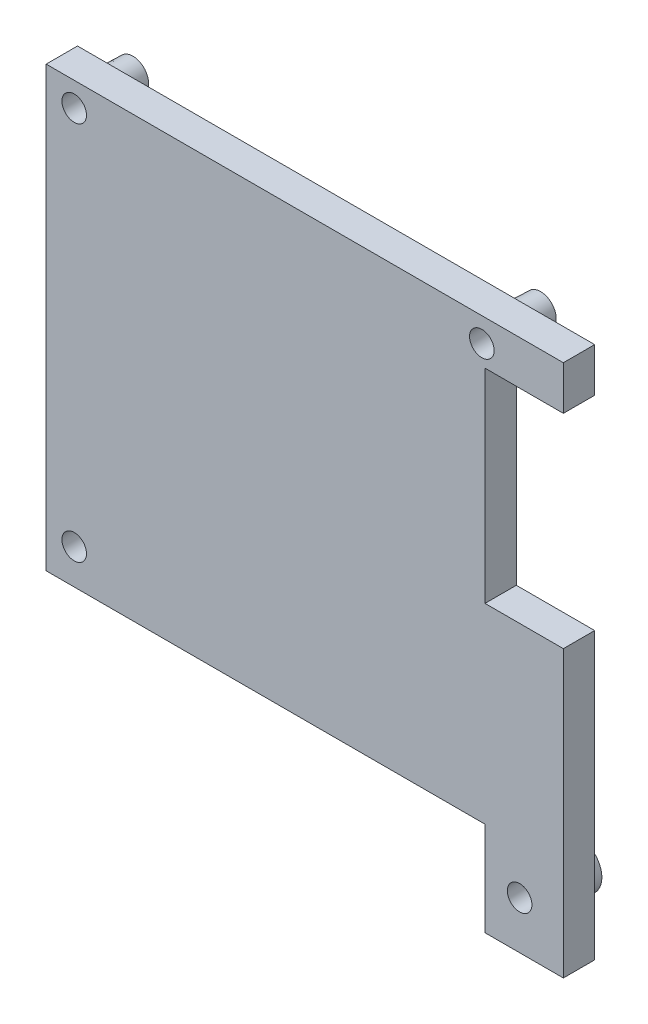
ISO-10303-21;
HEADER;
FILE_DESCRIPTION(('STEP AP214'),'2;1');
FILE_NAME('part.step','',(''),(''),'','','');
FILE_SCHEMA(('AUTOMOTIVE_DESIGN { 1 0 10303 214 1 1 1 1 }'));
ENDSEC;
DATA;
#1=APPLICATION_CONTEXT('core data for automotive mechanical design processes');
#2=APPLICATION_PROTOCOL_DEFINITION('international standard','automotive_design',2000,#1);
#3=PRODUCT_CONTEXT('',#1,'mechanical');
#4=PRODUCT('Part','Part','',(#3));
#5=PRODUCT_RELATED_PRODUCT_CATEGORY('part','',(#4));
#6=PRODUCT_DEFINITION_FORMATION('','',#4);
#7=PRODUCT_DEFINITION_CONTEXT('part definition',#1,'design');
#8=PRODUCT_DEFINITION('design','',#6,#7);
#9=PRODUCT_DEFINITION_SHAPE('','',#8);
#10=(LENGTH_UNIT() NAMED_UNIT(*) SI_UNIT(.MILLI.,.METRE.));
#11=(NAMED_UNIT(*) PLANE_ANGLE_UNIT() SI_UNIT($,.RADIAN.));
#12=(NAMED_UNIT(*) SI_UNIT($,.STERADIAN.) SOLID_ANGLE_UNIT());
#13=UNCERTAINTY_MEASURE_WITH_UNIT(LENGTH_MEASURE(1.E-05),#10,'distance_accuracy_value','');
#14=(GEOMETRIC_REPRESENTATION_CONTEXT(3) GLOBAL_UNCERTAINTY_ASSIGNED_CONTEXT((#13)) GLOBAL_UNIT_ASSIGNED_CONTEXT((#10,
#11,#12)) REPRESENTATION_CONTEXT('',''));
#15=CARTESIAN_POINT('',(0.,0.,0.));
#16=DIRECTION('',(0.,0.,1.));
#17=DIRECTION('',(1.,0.,0.));
#18=AXIS2_PLACEMENT_3D('',#15,#16,#17);
#19=CARTESIAN_POINT('',(-22.9481991421476,23.8341896442126,2.));
#20=DIRECTION('',(1.,0.,0.));
#21=DIRECTION('',(0.,1.,0.));
#22=AXIS2_PLACEMENT_3D('',#19,#20,#21);
#23=PLANE('',#22);
#24=DIRECTION('',(0.,-1.,0.));
#25=VECTOR('',#24,1.);
#26=CARTESIAN_POINT('',(-22.9481991421476,23.8341896442126,0.));
#27=LINE('',#26,#25);
#28=CARTESIAN_POINT('',(-22.9481991421476,23.8341896442126,0.));
#29=VERTEX_POINT('',#28);
#30=CARTESIAN_POINT('',(-22.9481991421476,-4.16581035578736,0.));
#31=VERTEX_POINT('',#30);
#32=EDGE_CURVE('E146',#29,#31,#27,.T.);
#33=ORIENTED_EDGE('',*,*,#32,.T.);
#34=DIRECTION('',(0.,0.,-1.));
#35=VECTOR('',#34,1.);
#36=CARTESIAN_POINT('',(-22.9481991421476,-4.16581035578736,2.));
#37=LINE('',#36,#35);
#38=CARTESIAN_POINT('',(-22.9481991421476,-4.16581035578736,2.));
#39=VERTEX_POINT('',#38);
#40=EDGE_CURVE('E11',#39,#31,#37,.T.);
#41=ORIENTED_EDGE('',*,*,#40,.F.);
#42=DIRECTION('',(0.,-1.,0.));
#43=VECTOR('',#42,1.);
#44=CARTESIAN_POINT('',(-22.9481991421476,23.8341896442126,2.));
#45=LINE('',#44,#43);
#46=CARTESIAN_POINT('',(-22.9481991421476,23.8341896442126,2.));
#47=VERTEX_POINT('',#46);
#48=EDGE_CURVE('E171',#47,#39,#45,.T.);
#49=ORIENTED_EDGE('',*,*,#48,.F.);
#50=DIRECTION('',(0.,0.,-1.));
#51=VECTOR('',#50,1.);
#52=CARTESIAN_POINT('',(-22.9481991421476,23.8341896442126,2.));
#53=LINE('',#52,#51);
#54=EDGE_CURVE('E53',#47,#29,#53,.T.);
#55=ORIENTED_EDGE('',*,*,#54,.T.);
#56=EDGE_LOOP('',(#33,#41,#49,#55));
#57=FACE_BOUND('',#56,.T.);
#58=ADVANCED_FACE('F37',(#57),#23,.F.);
#59=CARTESIAN_POINT('',(-22.9481991421476,-4.16581035578736,2.));
#60=DIRECTION('',(0.,1.,0.));
#61=DIRECTION('',(0.,0.,1.));
#62=AXIS2_PLACEMENT_3D('',#59,#60,#61);
#63=PLANE('',#62);
#64=DIRECTION('',(1.,0.,0.));
#65=VECTOR('',#64,1.);
#66=CARTESIAN_POINT('',(-22.9481991421476,-4.16581035578736,0.));
#67=LINE('',#66,#65);
#68=CARTESIAN_POINT('',(5.0518008578524,-4.16581035578736,0.));
#69=VERTEX_POINT('',#68);
#70=EDGE_CURVE('E148',#31,#69,#67,.T.);
#71=ORIENTED_EDGE('',*,*,#70,.T.);
#72=DIRECTION('',(0.,0.,-1.));
#73=VECTOR('',#72,1.);
#74=CARTESIAN_POINT('',(5.0518008578524,-4.16581035578736,2.));
#75=LINE('',#74,#73);
#76=CARTESIAN_POINT('',(5.0518008578524,-4.16581035578736,2.));
#77=VERTEX_POINT('',#76);
#78=EDGE_CURVE('E45',#77,#69,#75,.T.);
#79=ORIENTED_EDGE('',*,*,#78,.F.);
#80=DIRECTION('',(1.,0.,0.));
#81=VECTOR('',#80,1.);
#82=CARTESIAN_POINT('',(-22.9481991421476,-4.16581035578736,2.));
#83=LINE('',#82,#81);
#84=EDGE_CURVE('E97',#39,#77,#83,.T.);
#85=ORIENTED_EDGE('',*,*,#84,.F.);
#86=ORIENTED_EDGE('',*,*,#40,.T.);
#87=EDGE_LOOP('',(#71,#79,#85,#86));
#88=FACE_BOUND('',#87,.T.);
#89=ADVANCED_FACE('F226',(#88),#63,.F.);
#90=CARTESIAN_POINT('',(5.0518008578524,-4.16581035578736,2.));
#91=DIRECTION('',(1.,0.,0.));
#92=DIRECTION('',(0.,1.,0.));
#93=AXIS2_PLACEMENT_3D('',#90,#91,#92);
#94=PLANE('',#93);
#95=DIRECTION('',(0.,-1.,0.));
#96=VECTOR('',#95,1.);
#97=CARTESIAN_POINT('',(5.0518008578524,-4.16581035578736,0.));
#98=LINE('',#97,#96);
#99=CARTESIAN_POINT('',(5.0518008578524,-10.1658103557874,0.));
#100=VERTEX_POINT('',#99);
#101=EDGE_CURVE('E151',#69,#100,#98,.T.);
#102=ORIENTED_EDGE('',*,*,#101,.T.);
#103=DIRECTION('',(0.,0.,-1.));
#104=VECTOR('',#103,1.);
#105=CARTESIAN_POINT('',(5.0518008578524,-10.1658103557874,2.));
#106=LINE('',#105,#104);
#107=CARTESIAN_POINT('',(5.0518008578524,-10.1658103557874,2.));
#108=VERTEX_POINT('',#107);
#109=EDGE_CURVE('E181',#108,#100,#106,.T.);
#110=ORIENTED_EDGE('',*,*,#109,.F.);
#111=DIRECTION('',(0.,-1.,0.));
#112=VECTOR('',#111,1.);
#113=CARTESIAN_POINT('',(5.0518008578524,-4.16581035578736,2.));
#114=LINE('',#113,#112);
#115=EDGE_CURVE('E189',#77,#108,#114,.T.);
#116=ORIENTED_EDGE('',*,*,#115,.F.);
#117=ORIENTED_EDGE('',*,*,#78,.T.);
#118=EDGE_LOOP('',(#102,#110,#116,#117));
#119=FACE_BOUND('',#118,.T.);
#120=ADVANCED_FACE('F187',(#119),#94,.F.);
#121=CARTESIAN_POINT('',(5.0518008578524,-10.1658103557874,2.));
#122=DIRECTION('',(0.,1.,0.));
#123=DIRECTION('',(-1.,0.,0.));
#124=AXIS2_PLACEMENT_3D('',#121,#122,#123);
#125=PLANE('',#124);
#126=DIRECTION('',(1.,0.,0.));
#127=VECTOR('',#126,1.);
#128=CARTESIAN_POINT('',(5.0518008578524,-10.1658103557874,0.));
#129=LINE('',#128,#127);
#130=CARTESIAN_POINT('',(10.0518008578524,-10.1658103557874,0.));
#131=VERTEX_POINT('',#130);
#132=EDGE_CURVE('E153',#100,#131,#129,.T.);
#133=ORIENTED_EDGE('',*,*,#132,.T.);
#134=DIRECTION('',(0.,0.,-1.));
#135=VECTOR('',#134,1.);
#136=CARTESIAN_POINT('',(10.0518008578524,-10.1658103557874,2.));
#137=LINE('',#136,#135);
#138=CARTESIAN_POINT('',(10.0518008578524,-10.1658103557874,2.));
#139=VERTEX_POINT('',#138);
#140=EDGE_CURVE('E179',#139,#131,#137,.T.);
#141=ORIENTED_EDGE('',*,*,#140,.F.);
#142=DIRECTION('',(1.,0.,0.));
#143=VECTOR('',#142,1.);
#144=CARTESIAN_POINT('',(5.0518008578524,-10.1658103557874,2.));
#145=LINE('',#144,#143);
#146=EDGE_CURVE('E199',#108,#139,#145,.T.);
#147=ORIENTED_EDGE('',*,*,#146,.F.);
#148=ORIENTED_EDGE('',*,*,#109,.T.);
#149=EDGE_LOOP('',(#133,#141,#147,#148));
#150=FACE_BOUND('',#149,.T.);
#151=ADVANCED_FACE('F196',(#150),#125,.F.);
#152=CARTESIAN_POINT('',(10.0518008578524,8.03418964421264,2.));
#153=DIRECTION('',(1.,0.,0.));
#154=DIRECTION('',(0.,1.,0.));
#155=AXIS2_PLACEMENT_3D('',#152,#153,#154);
#156=PLANE('',#155);
#157=DIRECTION('',(0.,-1.,0.));
#158=VECTOR('',#157,1.);
#159=CARTESIAN_POINT('',(10.0518008578524,8.03418964421264,0.));
#160=LINE('',#159,#158);
#161=CARTESIAN_POINT('',(10.0518008578524,8.03418964421264,0.));
#162=VERTEX_POINT('',#161);
#163=EDGE_CURVE('E156',#162,#131,#160,.T.);
#164=ORIENTED_EDGE('',*,*,#163,.F.);
#165=DIRECTION('',(0.,0.,-1.));
#166=VECTOR('',#165,1.);
#167=CARTESIAN_POINT('',(10.0518008578524,8.03418964421264,2.));
#168=LINE('',#167,#166);
#169=CARTESIAN_POINT('',(10.0518008578524,8.03418964421264,2.));
#170=VERTEX_POINT('',#169);
#171=EDGE_CURVE('E177',#170,#162,#168,.T.);
#172=ORIENTED_EDGE('',*,*,#171,.F.);
#173=DIRECTION('',(0.,-1.,0.));
#174=VECTOR('',#173,1.);
#175=CARTESIAN_POINT('',(10.0518008578524,8.03418964421264,2.));
#176=LINE('',#175,#174);
#177=EDGE_CURVE('E201',#170,#139,#176,.T.);
#178=ORIENTED_EDGE('',*,*,#177,.T.);
#179=ORIENTED_EDGE('',*,*,#140,.T.);
#180=EDGE_LOOP('',(#164,#172,#178,#179));
#181=FACE_BOUND('',#180,.T.);
#182=ADVANCED_FACE('F437',(#181),#156,.T.);
#183=CARTESIAN_POINT('',(5.0518008578524,8.03418964421264,2.));
#184=DIRECTION('',(0.,1.,0.));
#185=DIRECTION('',(0.,0.,1.));
#186=AXIS2_PLACEMENT_3D('',#183,#184,#185);
#187=PLANE('',#186);
#188=DIRECTION('',(1.,0.,0.));
#189=VECTOR('',#188,1.);
#190=CARTESIAN_POINT('',(5.0518008578524,8.03418964421264,0.));
#191=LINE('',#190,#189);
#192=CARTESIAN_POINT('',(5.0518008578524,8.03418964421264,0.));
#193=VERTEX_POINT('',#192);
#194=EDGE_CURVE('E159',#193,#162,#191,.T.);
#195=ORIENTED_EDGE('',*,*,#194,.F.);
#196=DIRECTION('',(0.,0.,-1.));
#197=VECTOR('',#196,1.);
#198=CARTESIAN_POINT('',(5.0518008578524,8.03418964421264,2.));
#199=LINE('',#198,#197);
#200=CARTESIAN_POINT('',(5.0518008578524,8.03418964421264,2.));
#201=VERTEX_POINT('',#200);
#202=EDGE_CURVE('E175',#201,#193,#199,.T.);
#203=ORIENTED_EDGE('',*,*,#202,.F.);
#204=DIRECTION('',(1.,0.,0.));
#205=VECTOR('',#204,1.);
#206=CARTESIAN_POINT('',(5.0518008578524,8.03418964421264,2.));
#207=LINE('',#206,#205);
#208=EDGE_CURVE('E203',#201,#170,#207,.T.);
#209=ORIENTED_EDGE('',*,*,#208,.T.);
#210=ORIENTED_EDGE('',*,*,#171,.T.);
#211=EDGE_LOOP('',(#195,#203,#209,#210));
#212=FACE_BOUND('',#211,.T.);
#213=ADVANCED_FACE('F428',(#212),#187,.T.);
#214=CARTESIAN_POINT('',(5.0518008578524,21.0341896442126,2.));
#215=DIRECTION('',(1.,0.,0.));
#216=DIRECTION('',(0.,1.,0.));
#217=AXIS2_PLACEMENT_3D('',#214,#215,#216);
#218=PLANE('',#217);
#219=DIRECTION('',(0.,-1.,0.));
#220=VECTOR('',#219,1.);
#221=CARTESIAN_POINT('',(5.0518008578524,21.0341896442126,0.));
#222=LINE('',#221,#220);
#223=CARTESIAN_POINT('',(5.0518008578524,21.0341896442126,0.));
#224=VERTEX_POINT('',#223);
#225=EDGE_CURVE('E162',#224,#193,#222,.T.);
#226=ORIENTED_EDGE('',*,*,#225,.F.);
#227=DIRECTION('',(0.,0.,-1.));
#228=VECTOR('',#227,1.);
#229=CARTESIAN_POINT('',(5.0518008578524,21.0341896442126,2.));
#230=LINE('',#229,#228);
#231=CARTESIAN_POINT('',(5.0518008578524,21.0341896442126,2.));
#232=VERTEX_POINT('',#231);
#233=EDGE_CURVE('E128',#232,#224,#230,.T.);
#234=ORIENTED_EDGE('',*,*,#233,.F.);
#235=DIRECTION('',(0.,-1.,0.));
#236=VECTOR('',#235,1.);
#237=CARTESIAN_POINT('',(5.0518008578524,21.0341896442126,2.));
#238=LINE('',#237,#236);
#239=EDGE_CURVE('E138',#232,#201,#238,.T.);
#240=ORIENTED_EDGE('',*,*,#239,.T.);
#241=ORIENTED_EDGE('',*,*,#202,.T.);
#242=EDGE_LOOP('',(#226,#234,#240,#241));
#243=FACE_BOUND('',#242,.T.);
#244=ADVANCED_FACE('F211',(#243),#218,.T.);
#245=CARTESIAN_POINT('',(10.0518008578524,21.0341896442126,2.));
#246=DIRECTION('',(0.,-1.,0.));
#247=DIRECTION('',(0.,0.,-1.));
#248=AXIS2_PLACEMENT_3D('',#245,#246,#247);
#249=PLANE('',#248);
#250=DIRECTION('',(-1.,0.,0.));
#251=VECTOR('',#250,1.);
#252=CARTESIAN_POINT('',(10.0518008578524,21.0341896442126,0.));
#253=LINE('',#252,#251);
#254=CARTESIAN_POINT('',(10.0518008578524,21.0341896442126,0.));
#255=VERTEX_POINT('',#254);
#256=EDGE_CURVE('E124',#255,#224,#253,.T.);
#257=ORIENTED_EDGE('',*,*,#256,.F.);
#258=DIRECTION('',(0.,0.,-1.));
#259=VECTOR('',#258,1.);
#260=CARTESIAN_POINT('',(10.0518008578524,21.0341896442126,2.));
#261=LINE('',#260,#259);
#262=CARTESIAN_POINT('',(10.0518008578524,21.0341896442126,2.));
#263=VERTEX_POINT('',#262);
#264=EDGE_CURVE('E119',#263,#255,#261,.T.);
#265=ORIENTED_EDGE('',*,*,#264,.F.);
#266=DIRECTION('',(-1.,0.,0.));
#267=VECTOR('',#266,1.);
#268=CARTESIAN_POINT('',(10.0518008578524,21.0341896442126,2.));
#269=LINE('',#268,#267);
#270=EDGE_CURVE('E122',#263,#232,#269,.T.);
#271=ORIENTED_EDGE('',*,*,#270,.T.);
#272=ORIENTED_EDGE('',*,*,#233,.T.);
#273=EDGE_LOOP('',(#257,#265,#271,#272));
#274=FACE_BOUND('',#273,.T.);
#275=ADVANCED_FACE('F121',(#274),#249,.T.);
#276=CARTESIAN_POINT('',(10.0518008578524,23.8341896442126,2.));
#277=DIRECTION('',(1.,0.,0.));
#278=DIRECTION('',(0.,0.,-1.));
#279=AXIS2_PLACEMENT_3D('',#276,#277,#278);
#280=PLANE('',#279);
#281=DIRECTION('',(0.,-1.,0.));
#282=VECTOR('',#281,1.);
#283=CARTESIAN_POINT('',(10.0518008578524,23.8341896442126,0.));
#284=LINE('',#283,#282);
#285=CARTESIAN_POINT('',(10.0518008578524,23.8341896442126,0.));
#286=VERTEX_POINT('',#285);
#287=EDGE_CURVE('E166',#286,#255,#284,.T.);
#288=ORIENTED_EDGE('',*,*,#287,.F.);
#289=DIRECTION('',(0.,0.,-1.));
#290=VECTOR('',#289,1.);
#291=CARTESIAN_POINT('',(10.0518008578524,23.8341896442126,2.));
#292=LINE('',#291,#290);
#293=CARTESIAN_POINT('',(10.0518008578524,23.8341896442126,2.));
#294=VERTEX_POINT('',#293);
#295=EDGE_CURVE('E85',#294,#286,#292,.T.);
#296=ORIENTED_EDGE('',*,*,#295,.F.);
#297=DIRECTION('',(0.,-1.,0.));
#298=VECTOR('',#297,1.);
#299=CARTESIAN_POINT('',(10.0518008578524,23.8341896442126,2.));
#300=LINE('',#299,#298);
#301=EDGE_CURVE('E135',#294,#263,#300,.T.);
#302=ORIENTED_EDGE('',*,*,#301,.T.);
#303=ORIENTED_EDGE('',*,*,#264,.T.);
#304=EDGE_LOOP('',(#288,#296,#302,#303));
#305=FACE_BOUND('',#304,.T.);
#306=ADVANCED_FACE('F140',(#305),#280,.T.);
#307=CARTESIAN_POINT('',(-22.9481991421476,23.8341896442126,2.));
#308=DIRECTION('',(0.,1.,0.));
#309=DIRECTION('',(-1.,0.,0.));
#310=AXIS2_PLACEMENT_3D('',#307,#308,#309);
#311=PLANE('',#310);
#312=DIRECTION('',(1.,0.,0.));
#313=VECTOR('',#312,1.);
#314=CARTESIAN_POINT('',(-22.9481991421476,23.8341896442126,0.));
#315=LINE('',#314,#313);
#316=EDGE_CURVE('E168',#29,#286,#315,.T.);
#317=ORIENTED_EDGE('',*,*,#316,.F.);
#318=ORIENTED_EDGE('',*,*,#54,.F.);
#319=DIRECTION('',(1.,0.,0.));
#320=VECTOR('',#319,1.);
#321=CARTESIAN_POINT('',(-22.9481991421476,23.8341896442126,2.));
#322=LINE('',#321,#320);
#323=EDGE_CURVE('E141',#47,#294,#322,.T.);
#324=ORIENTED_EDGE('',*,*,#323,.T.);
#325=ORIENTED_EDGE('',*,*,#295,.T.);
#326=EDGE_LOOP('',(#317,#318,#324,#325));
#327=FACE_BOUND('',#326,.T.);
#328=ADVANCED_FACE('F213',(#327),#311,.T.);
#329=CARTESIAN_POINT('',(0.,0.,2.));
#330=DIRECTION('',(0.,0.,1.));
#331=DIRECTION('',(1.,0.,0.));
#332=AXIS2_PLACEMENT_3D('',#329,#330,#331);
#333=PLANE('',#332);
#334=CARTESIAN_POINT('',(4.8518008578524,22.2941896442126,2.));
#335=DIRECTION('',(0.,0.,1.));
#336=DIRECTION('',(1.,0.,0.));
#337=AXIS2_PLACEMENT_3D('',#334,#335,#336);
#338=CIRCLE('',#337,0.784613326778891);
#339=CARTESIAN_POINT('',(5.63641418463129,22.2941896442126,2.));
#340=VERTEX_POINT('',#339);
#341=EDGE_CURVE('E274',#340,#340,#338,.T.);
#342=ORIENTED_EDGE('',*,*,#341,.F.);
#343=EDGE_LOOP('',(#342));
#344=FACE_BOUND('',#343,.T.);
#345=CARTESIAN_POINT('',(-21.1581991421476,22.2941896442126,2.));
#346=DIRECTION('',(0.,0.,1.));
#347=DIRECTION('',(1.,0.,0.));
#348=AXIS2_PLACEMENT_3D('',#345,#346,#347);
#349=CIRCLE('',#348,0.784613326778891);
#350=CARTESIAN_POINT('',(-20.3735858153687,22.2941896442126,2.));
#351=VERTEX_POINT('',#350);
#352=EDGE_CURVE('E262',#351,#351,#349,.T.);
#353=ORIENTED_EDGE('',*,*,#352,.F.);
#354=EDGE_LOOP('',(#353));
#355=FACE_BOUND('',#354,.T.);
#356=CARTESIAN_POINT('',(-21.1581991421476,-1.93581035578735,2.));
#357=DIRECTION('',(0.,0.,1.));
#358=DIRECTION('',(1.,0.,0.));
#359=AXIS2_PLACEMENT_3D('',#356,#357,#358);
#360=CIRCLE('',#359,0.784613326778891);
#361=CARTESIAN_POINT('',(-20.3735858153687,-1.93581035578735,2.));
#362=VERTEX_POINT('',#361);
#363=EDGE_CURVE('E250',#362,#362,#360,.T.);
#364=ORIENTED_EDGE('',*,*,#363,.F.);
#365=EDGE_LOOP('',(#364));
#366=FACE_BOUND('',#365,.T.);
#367=CARTESIAN_POINT('',(7.2618008578524,-7.12581035578737,2.));
#368=DIRECTION('',(0.,0.,1.));
#369=DIRECTION('',(1.,0.,0.));
#370=AXIS2_PLACEMENT_3D('',#367,#368,#369);
#371=CIRCLE('',#370,0.784613326778891);
#372=CARTESIAN_POINT('',(8.04641418463129,-7.12581035578737,2.));
#373=VERTEX_POINT('',#372);
#374=EDGE_CURVE('E238',#373,#373,#371,.T.);
#375=ORIENTED_EDGE('',*,*,#374,.F.);
#376=EDGE_LOOP('',(#375));
#377=FACE_BOUND('',#376,.T.);
#378=ORIENTED_EDGE('',*,*,#48,.T.);
#379=ORIENTED_EDGE('',*,*,#84,.T.);
#380=ORIENTED_EDGE('',*,*,#115,.T.);
#381=ORIENTED_EDGE('',*,*,#146,.T.);
#382=ORIENTED_EDGE('',*,*,#177,.F.);
#383=ORIENTED_EDGE('',*,*,#208,.F.);
#384=ORIENTED_EDGE('',*,*,#239,.F.);
#385=ORIENTED_EDGE('',*,*,#270,.F.);
#386=ORIENTED_EDGE('',*,*,#301,.F.);
#387=ORIENTED_EDGE('',*,*,#323,.F.);
#388=EDGE_LOOP('',(#378,#379,#380,#381,#382,#383,#384,#385,#386,#387));
#389=FACE_BOUND('',#388,.T.);
#390=ADVANCED_FACE('F133',(#344,#355,#366,#377,#389),#333,.T.);
#391=CARTESIAN_POINT('',(0.,0.,0.));
#392=DIRECTION('',(0.,0.,1.));
#393=DIRECTION('',(1.,0.,0.));
#394=AXIS2_PLACEMENT_3D('',#391,#392,#393);
#395=PLANE('',#394);
#396=CARTESIAN_POINT('',(4.8518008578524,22.2941896442126,0.));
#397=DIRECTION('',(0.,0.,1.));
#398=DIRECTION('',(1.,0.,0.));
#399=AXIS2_PLACEMENT_3D('',#396,#397,#398);
#400=CIRCLE('',#399,1.06097166353259);
#401=CARTESIAN_POINT('',(5.91277252138499,22.2941896442126,0.));
#402=VERTEX_POINT('',#401);
#403=EDGE_CURVE('E268',#402,#402,#400,.F.);
#404=ORIENTED_EDGE('',*,*,#403,.F.);
#405=EDGE_LOOP('',(#404));
#406=FACE_BOUND('',#405,.T.);
#407=CARTESIAN_POINT('',(-21.1581991421476,22.2941896442126,0.));
#408=DIRECTION('',(0.,0.,1.));
#409=DIRECTION('',(1.,0.,0.));
#410=AXIS2_PLACEMENT_3D('',#407,#408,#409);
#411=CIRCLE('',#410,1.06097166353259);
#412=CARTESIAN_POINT('',(-20.097227478615,22.2941896442126,0.));
#413=VERTEX_POINT('',#412);
#414=EDGE_CURVE('E256',#413,#413,#411,.F.);
#415=ORIENTED_EDGE('',*,*,#414,.F.);
#416=EDGE_LOOP('',(#415));
#417=FACE_BOUND('',#416,.T.);
#418=CARTESIAN_POINT('',(-21.1581991421476,-1.93581035578735,0.));
#419=DIRECTION('',(0.,0.,1.));
#420=DIRECTION('',(1.,0.,0.));
#421=AXIS2_PLACEMENT_3D('',#418,#419,#420);
#422=CIRCLE('',#421,1.56097166353259);
#423=CARTESIAN_POINT('',(-19.597227478615,-1.93581035578735,0.));
#424=VERTEX_POINT('',#423);
#425=EDGE_CURVE('E244',#424,#424,#422,.F.);
#426=ORIENTED_EDGE('',*,*,#425,.F.);
#427=EDGE_LOOP('',(#426));
#428=FACE_BOUND('',#427,.T.);
#429=CARTESIAN_POINT('',(7.2618008578524,-7.12581035578737,0.));
#430=DIRECTION('',(0.,0.,1.));
#431=DIRECTION('',(1.,0.,0.));
#432=AXIS2_PLACEMENT_3D('',#429,#430,#431);
#433=CIRCLE('',#432,1.56097166353259);
#434=CARTESIAN_POINT('',(8.822772521385,-7.12581035578737,0.));
#435=VERTEX_POINT('',#434);
#436=EDGE_CURVE('E149',#435,#435,#433,.F.);
#437=ORIENTED_EDGE('',*,*,#436,.F.);
#438=EDGE_LOOP('',(#437));
#439=FACE_BOUND('',#438,.T.);
#440=ORIENTED_EDGE('',*,*,#32,.F.);
#441=ORIENTED_EDGE('',*,*,#316,.T.);
#442=ORIENTED_EDGE('',*,*,#287,.T.);
#443=ORIENTED_EDGE('',*,*,#256,.T.);
#444=ORIENTED_EDGE('',*,*,#225,.T.);
#445=ORIENTED_EDGE('',*,*,#194,.T.);
#446=ORIENTED_EDGE('',*,*,#163,.T.);
#447=ORIENTED_EDGE('',*,*,#132,.F.);
#448=ORIENTED_EDGE('',*,*,#101,.F.);
#449=ORIENTED_EDGE('',*,*,#70,.F.);
#450=EDGE_LOOP('',(#440,#441,#442,#443,#444,#445,#446,#447,#448,#449));
#451=FACE_BOUND('',#450,.T.);
#452=ADVANCED_FACE('F192',(#406,#417,#428,#439,#451),#395,.F.);
#453=CARTESIAN_POINT('',(7.2618008578524,-7.12581035578737,-1.74600000000003));
#454=DIRECTION('',(0.,0.,-1.));
#455=DIRECTION('',(0.894427190999916,-0.447213595499958,0.));
#456=AXIS2_PLACEMENT_3D('',#453,#454,#455);
#457=PLANE('',#456);
#458=CARTESIAN_POINT('',(7.2618008578524,-7.12581035578737,-1.746));
#459=DIRECTION('',(0.,0.,1.));
#460=DIRECTION('',(-0.894427190999916,0.447213595499958,0.));
#461=AXIS2_PLACEMENT_3D('',#458,#459,#460);
#462=CIRCLE('',#461,0.85);
#463=CARTESIAN_POINT('',(6.50153774550247,-6.7456787996124,-1.746));
#464=VERTEX_POINT('',#463);
#465=EDGE_CURVE('E241',#464,#464,#462,.T.);
#466=ORIENTED_EDGE('',*,*,#465,.T.);
#467=EDGE_LOOP('',(#466));
#468=FACE_BOUND('',#467,.T.);
#469=CARTESIAN_POINT('',(7.2618008578524,-7.12581035578737,-1.74600000000003));
#470=DIRECTION('',(0.,0.,1.));
#471=DIRECTION('',(-0.894427190999916,0.447213595499958,0.));
#472=AXIS2_PLACEMENT_3D('',#469,#470,#471);
#473=CIRCLE('',#472,1.5);
#474=CARTESIAN_POINT('',(5.92016007135253,-6.45498996253743,-1.74600000000003));
#475=VERTEX_POINT('',#474);
#476=EDGE_CURVE('E235',#475,#475,#473,.T.);
#477=ORIENTED_EDGE('',*,*,#476,.F.);
#478=EDGE_LOOP('',(#477));
#479=FACE_BOUND('',#478,.T.);
#480=ADVANCED_FACE('F326',(#468,#479),#457,.T.);
#481=CARTESIAN_POINT('',(7.2618008578524,-7.12581035578737,-1.74600000000003));
#482=DIRECTION('',(0.,0.,1.));
#483=DIRECTION('',(-0.894427190999916,0.447213595499958,0.));
#484=AXIS2_PLACEMENT_3D('',#481,#482,#483);
#485=CONICAL_SURFACE('',#484,1.5,0.0349065850398865);
#486=ORIENTED_EDGE('',*,*,#476,.T.);
#487=EDGE_LOOP('',(#486));
#488=FACE_BOUND('',#487,.T.);
#489=ORIENTED_EDGE('',*,*,#436,.T.);
#490=EDGE_LOOP('',(#489));
#491=FACE_BOUND('',#490,.T.);
#492=ADVANCED_FACE('F324',(#488,#491),#485,.T.);
#493=CARTESIAN_POINT('',(7.2618008578524,-7.12581035578737,3.254));
#494=DIRECTION('',(0.,0.,-1.));
#495=DIRECTION('',(0.894427190999916,-0.447213595499958,0.));
#496=AXIS2_PLACEMENT_3D('',#493,#494,#495);
#497=CONICAL_SURFACE('',#496,0.762724675358904,0.0174532925199449);
#498=ORIENTED_EDGE('',*,*,#374,.T.);
#499=EDGE_LOOP('',(#498));
#500=FACE_BOUND('',#499,.T.);
#501=ORIENTED_EDGE('',*,*,#465,.F.);
#502=EDGE_LOOP('',(#501));
#503=FACE_BOUND('',#502,.T.);
#504=ADVANCED_FACE('F317',(#500,#503),#497,.F.);
#505=CARTESIAN_POINT('',(-21.1581991421476,-1.93581035578735,-1.74600000000003));
#506=DIRECTION('',(0.,0.,-1.));
#507=DIRECTION('',(0.894427190999916,-0.447213595499958,0.));
#508=AXIS2_PLACEMENT_3D('',#505,#506,#507);
#509=PLANE('',#508);
#510=CARTESIAN_POINT('',(-21.1581991421476,-1.93581035578735,-1.746));
#511=DIRECTION('',(0.,0.,1.));
#512=DIRECTION('',(-0.894427190999916,0.447213595499958,0.));
#513=AXIS2_PLACEMENT_3D('',#510,#511,#512);
#514=CIRCLE('',#513,0.85);
#515=CARTESIAN_POINT('',(-21.9184622544975,-1.55567879961239,-1.746));
#516=VERTEX_POINT('',#515);
#517=EDGE_CURVE('E253',#516,#516,#514,.T.);
#518=ORIENTED_EDGE('',*,*,#517,.T.);
#519=EDGE_LOOP('',(#518));
#520=FACE_BOUND('',#519,.T.);
#521=CARTESIAN_POINT('',(-21.1581991421476,-1.93581035578735,-1.74600000000003));
#522=DIRECTION('',(0.,0.,1.));
#523=DIRECTION('',(-0.894427190999916,0.447213595499958,0.));
#524=AXIS2_PLACEMENT_3D('',#521,#522,#523);
#525=CIRCLE('',#524,1.5);
#526=CARTESIAN_POINT('',(-22.4998399286475,-1.26498996253742,-1.74600000000003));
#527=VERTEX_POINT('',#526);
#528=EDGE_CURVE('E247',#527,#527,#525,.T.);
#529=ORIENTED_EDGE('',*,*,#528,.F.);
#530=EDGE_LOOP('',(#529));
#531=FACE_BOUND('',#530,.T.);
#532=ADVANCED_FACE('F314',(#520,#531),#509,.T.);
#533=CARTESIAN_POINT('',(-21.1581991421476,-1.93581035578735,-1.74600000000003));
#534=DIRECTION('',(0.,0.,1.));
#535=DIRECTION('',(-0.894427190999916,0.447213595499958,0.));
#536=AXIS2_PLACEMENT_3D('',#533,#534,#535);
#537=CONICAL_SURFACE('',#536,1.5,0.0349065850398865);
#538=ORIENTED_EDGE('',*,*,#528,.T.);
#539=EDGE_LOOP('',(#538));
#540=FACE_BOUND('',#539,.T.);
#541=ORIENTED_EDGE('',*,*,#425,.T.);
#542=EDGE_LOOP('',(#541));
#543=FACE_BOUND('',#542,.T.);
#544=ADVANCED_FACE('F312',(#540,#543),#537,.T.);
#545=CARTESIAN_POINT('',(-21.1581991421476,-1.93581035578735,3.254));
#546=DIRECTION('',(0.,0.,-1.));
#547=DIRECTION('',(0.894427190999916,-0.447213595499958,0.));
#548=AXIS2_PLACEMENT_3D('',#545,#546,#547);
#549=CONICAL_SURFACE('',#548,0.762724675358904,0.0174532925199449);
#550=ORIENTED_EDGE('',*,*,#363,.T.);
#551=EDGE_LOOP('',(#550));
#552=FACE_BOUND('',#551,.T.);
#553=ORIENTED_EDGE('',*,*,#517,.F.);
#554=EDGE_LOOP('',(#553));
#555=FACE_BOUND('',#554,.T.);
#556=ADVANCED_FACE('F305',(#552,#555),#549,.F.);
#557=CARTESIAN_POINT('',(-21.1581991421476,22.2941896442126,-1.74600000000003));
#558=DIRECTION('',(0.,0.,-1.));
#559=DIRECTION('',(0.894427190999916,-0.447213595499958,0.));
#560=AXIS2_PLACEMENT_3D('',#557,#558,#559);
#561=PLANE('',#560);
#562=CARTESIAN_POINT('',(-21.1581991421476,22.2941896442126,-1.746));
#563=DIRECTION('',(0.,0.,1.));
#564=DIRECTION('',(-0.894427190999916,0.447213595499958,0.));
#565=AXIS2_PLACEMENT_3D('',#562,#563,#564);
#566=CIRCLE('',#565,0.85);
#567=CARTESIAN_POINT('',(-21.9184622544975,22.6743212003876,-1.746));
#568=VERTEX_POINT('',#567);
#569=EDGE_CURVE('E265',#568,#568,#566,.T.);
#570=ORIENTED_EDGE('',*,*,#569,.T.);
#571=EDGE_LOOP('',(#570));
#572=FACE_BOUND('',#571,.T.);
#573=CARTESIAN_POINT('',(-21.1581991421476,22.2941896442126,-1.74600000000003));
#574=DIRECTION('',(0.,0.,1.));
#575=DIRECTION('',(-0.894427190999916,0.447213595499958,0.));
#576=AXIS2_PLACEMENT_3D('',#573,#574,#575);
#577=CIRCLE('',#576,1.);
#578=CARTESIAN_POINT('',(-22.0526263331475,22.7414032397126,-1.74600000000003));
#579=VERTEX_POINT('',#578);
#580=EDGE_CURVE('E259',#579,#579,#577,.T.);
#581=ORIENTED_EDGE('',*,*,#580,.F.);
#582=EDGE_LOOP('',(#581));
#583=FACE_BOUND('',#582,.T.);
#584=ADVANCED_FACE('F302',(#572,#583),#561,.T.);
#585=CARTESIAN_POINT('',(-21.1581991421476,22.2941896442126,-1.74600000000003));
#586=DIRECTION('',(0.,0.,1.));
#587=DIRECTION('',(-0.894427190999916,0.447213595499958,0.));
#588=AXIS2_PLACEMENT_3D('',#585,#586,#587);
#589=CONICAL_SURFACE('',#588,1.,0.0349065850398865);
#590=ORIENTED_EDGE('',*,*,#580,.T.);
#591=EDGE_LOOP('',(#590));
#592=FACE_BOUND('',#591,.T.);
#593=ORIENTED_EDGE('',*,*,#414,.T.);
#594=EDGE_LOOP('',(#593));
#595=FACE_BOUND('',#594,.T.);
#596=ADVANCED_FACE('F300',(#592,#595),#589,.T.);
#597=CARTESIAN_POINT('',(-21.1581991421476,22.2941896442126,3.254));
#598=DIRECTION('',(0.,0.,-1.));
#599=DIRECTION('',(0.894427190999916,-0.447213595499958,0.));
#600=AXIS2_PLACEMENT_3D('',#597,#598,#599);
#601=CONICAL_SURFACE('',#600,0.762724675358904,0.0174532925199449);
#602=ORIENTED_EDGE('',*,*,#352,.T.);
#603=EDGE_LOOP('',(#602));
#604=FACE_BOUND('',#603,.T.);
#605=ORIENTED_EDGE('',*,*,#569,.F.);
#606=EDGE_LOOP('',(#605));
#607=FACE_BOUND('',#606,.T.);
#608=ADVANCED_FACE('F296',(#604,#607),#601,.F.);
#609=CARTESIAN_POINT('',(4.8518008578524,22.2941896442126,-1.74600000000003));
#610=DIRECTION('',(0.,0.,-1.));
#611=DIRECTION('',(0.894427190999916,-0.447213595499958,0.));
#612=AXIS2_PLACEMENT_3D('',#609,#610,#611);
#613=PLANE('',#612);
#614=CARTESIAN_POINT('',(4.8518008578524,22.2941896442126,-1.746));
#615=DIRECTION('',(0.,0.,1.));
#616=DIRECTION('',(-0.894427190999916,0.447213595499958,0.));
#617=AXIS2_PLACEMENT_3D('',#614,#615,#616);
#618=CIRCLE('',#617,0.85);
#619=CARTESIAN_POINT('',(4.09153774550247,22.6743212003876,-1.746));
#620=VERTEX_POINT('',#619);
#621=EDGE_CURVE('E277',#620,#620,#618,.T.);
#622=ORIENTED_EDGE('',*,*,#621,.T.);
#623=EDGE_LOOP('',(#622));
#624=FACE_BOUND('',#623,.T.);
#625=CARTESIAN_POINT('',(4.8518008578524,22.2941896442126,-1.74600000000003));
#626=DIRECTION('',(0.,0.,1.));
#627=DIRECTION('',(-0.894427190999916,0.447213595499958,0.));
#628=AXIS2_PLACEMENT_3D('',#625,#626,#627);
#629=CIRCLE('',#628,1.);
#630=CARTESIAN_POINT('',(3.95737366685248,22.7414032397126,-1.74600000000003));
#631=VERTEX_POINT('',#630);
#632=EDGE_CURVE('E271',#631,#631,#629,.T.);
#633=ORIENTED_EDGE('',*,*,#632,.F.);
#634=EDGE_LOOP('',(#633));
#635=FACE_BOUND('',#634,.T.);
#636=ADVANCED_FACE('F281',(#624,#635),#613,.T.);
#637=CARTESIAN_POINT('',(4.8518008578524,22.2941896442126,-1.74600000000003));
#638=DIRECTION('',(0.,0.,1.));
#639=DIRECTION('',(-0.894427190999916,0.447213595499958,0.));
#640=AXIS2_PLACEMENT_3D('',#637,#638,#639);
#641=CONICAL_SURFACE('',#640,1.,0.0349065850398865);
#642=ORIENTED_EDGE('',*,*,#632,.T.);
#643=EDGE_LOOP('',(#642));
#644=FACE_BOUND('',#643,.T.);
#645=ORIENTED_EDGE('',*,*,#403,.T.);
#646=EDGE_LOOP('',(#645));
#647=FACE_BOUND('',#646,.T.);
#648=ADVANCED_FACE('F286',(#644,#647),#641,.T.);
#649=CARTESIAN_POINT('',(4.8518008578524,22.2941896442126,3.254));
#650=DIRECTION('',(0.,0.,-1.));
#651=DIRECTION('',(0.894427190999916,-0.447213595499958,0.));
#652=AXIS2_PLACEMENT_3D('',#649,#650,#651);
#653=CONICAL_SURFACE('',#652,0.762724675358904,0.0174532925199449);
#654=ORIENTED_EDGE('',*,*,#341,.T.);
#655=EDGE_LOOP('',(#654));
#656=FACE_BOUND('',#655,.T.);
#657=ORIENTED_EDGE('',*,*,#621,.F.);
#658=EDGE_LOOP('',(#657));
#659=FACE_BOUND('',#658,.T.);
#660=ADVANCED_FACE('F284',(#656,#659),#653,.F.);
#661=CLOSED_SHELL('',(#58,#89,#120,#151,#182,#213,#244,#275,#306,#328,#390,#452,#480,#492,#504,
#532,#544,#556,#584,#596,#608,#636,#648,#660));
#662=MANIFOLD_SOLID_BREP('B2',#661);
#663=ADVANCED_BREP_SHAPE_REPRESENTATION('',(#18,#662),#14);
#664=SHAPE_DEFINITION_REPRESENTATION(#9,#663);
ENDSEC;
END-ISO-10303-21;
